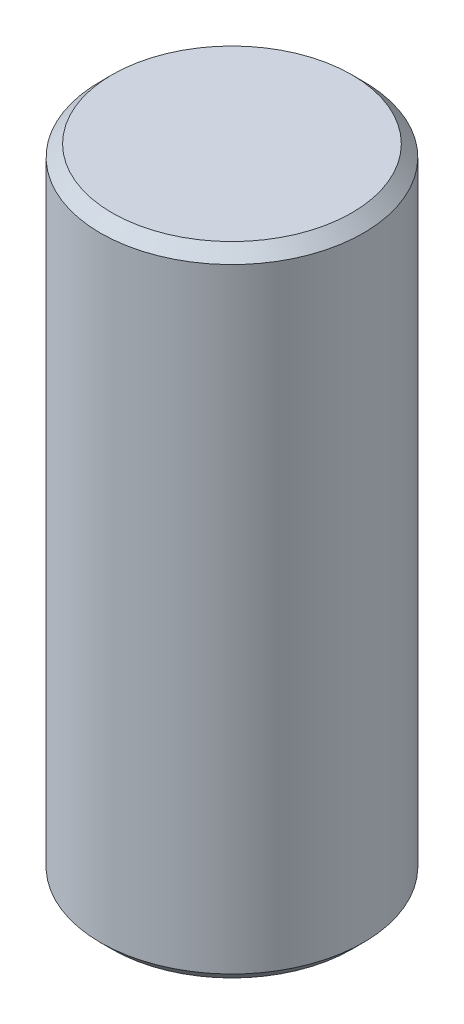
ISO-10303-21;
HEADER;
FILE_DESCRIPTION(('STEP AP214'),'2;1');
FILE_NAME('part.step','',(''),(''),'','','');
FILE_SCHEMA(('AUTOMOTIVE_DESIGN { 1 0 10303 214 1 1 1 1 }'));
ENDSEC;
DATA;
#1=APPLICATION_CONTEXT('core data for automotive mechanical design processes');
#2=APPLICATION_PROTOCOL_DEFINITION('international standard','automotive_design',2000,#1);
#3=PRODUCT_CONTEXT('',#1,'mechanical');
#4=PRODUCT('Part','Part','',(#3));
#5=PRODUCT_RELATED_PRODUCT_CATEGORY('part','',(#4));
#6=PRODUCT_DEFINITION_FORMATION('','',#4);
#7=PRODUCT_DEFINITION_CONTEXT('part definition',#1,'design');
#8=PRODUCT_DEFINITION('design','',#6,#7);
#9=PRODUCT_DEFINITION_SHAPE('','',#8);
#10=(LENGTH_UNIT() NAMED_UNIT(*) SI_UNIT(.MILLI.,.METRE.));
#11=(NAMED_UNIT(*) PLANE_ANGLE_UNIT() SI_UNIT($,.RADIAN.));
#12=(NAMED_UNIT(*) SI_UNIT($,.STERADIAN.) SOLID_ANGLE_UNIT());
#13=UNCERTAINTY_MEASURE_WITH_UNIT(LENGTH_MEASURE(1.E-05),#10,'distance_accuracy_value','');
#14=(GEOMETRIC_REPRESENTATION_CONTEXT(3) GLOBAL_UNCERTAINTY_ASSIGNED_CONTEXT((#13)) GLOBAL_UNIT_ASSIGNED_CONTEXT((#10,
#11,#12)) REPRESENTATION_CONTEXT('',''));
#15=CARTESIAN_POINT('',(0.,0.,0.));
#16=DIRECTION('',(0.,0.,1.));
#17=DIRECTION('',(1.,0.,0.));
#18=AXIS2_PLACEMENT_3D('',#15,#16,#17);
#19=CARTESIAN_POINT('',(0.,82.,0.));
#20=DIRECTION('',(0.,-1.,0.));
#21=DIRECTION('',(0.,0.,-1.));
#22=AXIS2_PLACEMENT_3D('',#19,#20,#21);
#23=CYLINDRICAL_SURFACE('',#22,16.9);
#24=CARTESIAN_POINT('',(0.,1.50000000000002,0.));
#25=DIRECTION('',(0.,1.,0.));
#26=DIRECTION('',(0.,0.,1.));
#27=AXIS2_PLACEMENT_3D('',#24,#25,#26);
#28=CIRCLE('',#27,16.9);
#29=CARTESIAN_POINT('',(0.,1.50000000000002,16.9));
#30=VERTEX_POINT('',#29);
#31=EDGE_CURVE('E45',#30,#30,#28,.T.);
#32=ORIENTED_EDGE('',*,*,#31,.T.);
#33=EDGE_LOOP('',(#32));
#34=FACE_BOUND('',#33,.T.);
#35=CARTESIAN_POINT('',(0.,80.5,0.));
#36=DIRECTION('',(0.,1.,0.));
#37=DIRECTION('',(0.,0.,1.));
#38=AXIS2_PLACEMENT_3D('',#35,#36,#37);
#39=CIRCLE('',#38,16.9);
#40=CARTESIAN_POINT('',(0.,80.5,16.9));
#41=VERTEX_POINT('',#40);
#42=EDGE_CURVE('E49',#41,#41,#39,.F.);
#43=ORIENTED_EDGE('',*,*,#42,.T.);
#44=EDGE_LOOP('',(#43));
#45=FACE_BOUND('',#44,.T.);
#46=ADVANCED_FACE('F33',(#34,#45),#23,.T.);
#47=CARTESIAN_POINT('',(0.,82.,0.));
#48=DIRECTION('',(0.,1.,0.));
#49=DIRECTION('',(0.,0.,1.));
#50=AXIS2_PLACEMENT_3D('',#47,#48,#49);
#51=PLANE('',#50);
#52=CARTESIAN_POINT('',(0.,82.,0.));
#53=DIRECTION('',(0.,1.,0.));
#54=DIRECTION('',(0.,0.,1.));
#55=AXIS2_PLACEMENT_3D('',#52,#53,#54);
#56=CIRCLE('',#55,15.4);
#57=CARTESIAN_POINT('',(0.,82.,15.4));
#58=VERTEX_POINT('',#57);
#59=EDGE_CURVE('E10',#58,#58,#56,.T.);
#60=ORIENTED_EDGE('',*,*,#59,.T.);
#61=EDGE_LOOP('',(#60));
#62=FACE_BOUND('',#61,.T.);
#63=ADVANCED_FACE('F65',(#62),#51,.T.);
#64=CARTESIAN_POINT('',(0.,0.,0.));
#65=DIRECTION('',(0.,1.,0.));
#66=DIRECTION('',(0.,0.,1.));
#67=AXIS2_PLACEMENT_3D('',#64,#65,#66);
#68=PLANE('',#67);
#69=CARTESIAN_POINT('',(0.,0.,0.));
#70=DIRECTION('',(0.,1.,0.));
#71=DIRECTION('',(0.,0.,1.));
#72=AXIS2_PLACEMENT_3D('',#69,#70,#71);
#73=CIRCLE('',#72,15.4);
#74=CARTESIAN_POINT('',(0.,0.,15.4));
#75=VERTEX_POINT('',#74);
#76=EDGE_CURVE('E41',#75,#75,#73,.F.);
#77=ORIENTED_EDGE('',*,*,#76,.T.);
#78=EDGE_LOOP('',(#77));
#79=FACE_BOUND('',#78,.T.);
#80=ADVANCED_FACE('F62',(#79),#68,.F.);
#81=CARTESIAN_POINT('',(0.,1.50000000000002,0.));
#82=DIRECTION('',(0.,1.,0.));
#83=DIRECTION('',(0.,0.,1.));
#84=AXIS2_PLACEMENT_3D('',#81,#82,#83);
#85=CONICAL_SURFACE('',#84,16.9,0.785398163397454);
#86=ORIENTED_EDGE('',*,*,#76,.F.);
#87=EDGE_LOOP('',(#86));
#88=FACE_BOUND('',#87,.T.);
#89=ORIENTED_EDGE('',*,*,#31,.F.);
#90=EDGE_LOOP('',(#89));
#91=FACE_BOUND('',#90,.T.);
#92=ADVANCED_FACE('F58',(#88,#91),#85,.T.);
#93=CARTESIAN_POINT('',(0.,82.,0.));
#94=DIRECTION('',(0.,-1.,0.));
#95=DIRECTION('',(0.,0.,-1.));
#96=AXIS2_PLACEMENT_3D('',#93,#94,#95);
#97=CONICAL_SURFACE('',#96,15.4,0.785398163397443);
#98=ORIENTED_EDGE('',*,*,#42,.F.);
#99=EDGE_LOOP('',(#98));
#100=FACE_BOUND('',#99,.T.);
#101=ORIENTED_EDGE('',*,*,#59,.F.);
#102=EDGE_LOOP('',(#101));
#103=FACE_BOUND('',#102,.T.);
#104=ADVANCED_FACE('F36',(#100,#103),#97,.T.);
#105=CLOSED_SHELL('',(#46,#63,#80,#92,#104));
#106=MANIFOLD_SOLID_BREP('B2',#105);
#107=ADVANCED_BREP_SHAPE_REPRESENTATION('',(#18,#106),#14);
#108=SHAPE_DEFINITION_REPRESENTATION(#9,#107);
ENDSEC;
END-ISO-10303-21;
